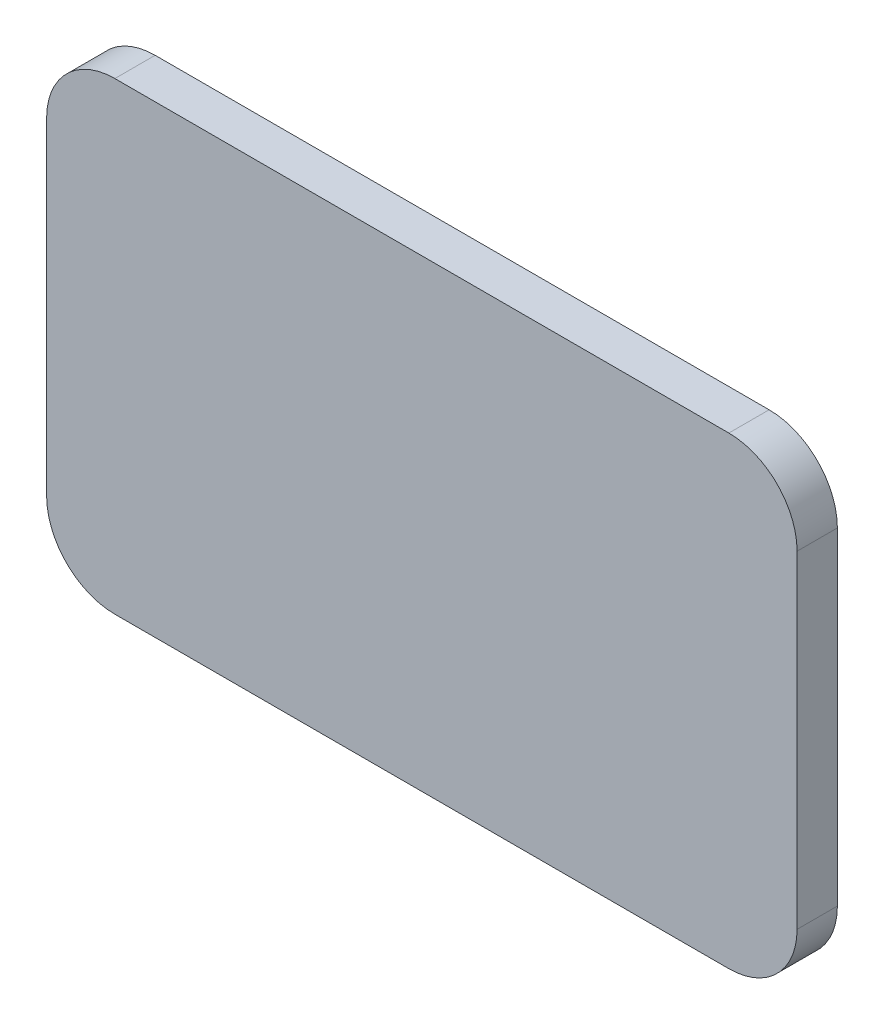
ISO-10303-21;
HEADER;
FILE_DESCRIPTION(('STEP AP214'),'2;1');
FILE_NAME('part.step','',(''),(''),'','','');
FILE_SCHEMA(('AUTOMOTIVE_DESIGN { 1 0 10303 214 1 1 1 1 }'));
ENDSEC;
DATA;
#1=APPLICATION_CONTEXT('core data for automotive mechanical design processes');
#2=APPLICATION_PROTOCOL_DEFINITION('international standard','automotive_design',2000,#1);
#3=PRODUCT_CONTEXT('',#1,'mechanical');
#4=PRODUCT('Part','Part','',(#3));
#5=PRODUCT_RELATED_PRODUCT_CATEGORY('part','',(#4));
#6=PRODUCT_DEFINITION_FORMATION('','',#4);
#7=PRODUCT_DEFINITION_CONTEXT('part definition',#1,'design');
#8=PRODUCT_DEFINITION('design','',#6,#7);
#9=PRODUCT_DEFINITION_SHAPE('','',#8);
#10=(LENGTH_UNIT() NAMED_UNIT(*) SI_UNIT(.MILLI.,.METRE.));
#11=(NAMED_UNIT(*) PLANE_ANGLE_UNIT() SI_UNIT($,.RADIAN.));
#12=(NAMED_UNIT(*) SI_UNIT($,.STERADIAN.) SOLID_ANGLE_UNIT());
#13=UNCERTAINTY_MEASURE_WITH_UNIT(LENGTH_MEASURE(1.E-05),#10,'distance_accuracy_value','');
#14=(GEOMETRIC_REPRESENTATION_CONTEXT(3) GLOBAL_UNCERTAINTY_ASSIGNED_CONTEXT((#13)) GLOBAL_UNIT_ASSIGNED_CONTEXT((#10,
#11,#12)) REPRESENTATION_CONTEXT('',''));
#15=CARTESIAN_POINT('',(0.,0.,0.));
#16=DIRECTION('',(0.,0.,1.));
#17=DIRECTION('',(1.,0.,0.));
#18=AXIS2_PLACEMENT_3D('',#15,#16,#17);
#19=CARTESIAN_POINT('',(2.54,14.732,-1.5));
#20=DIRECTION('',(0.,0.,1.));
#21=DIRECTION('',(1.,0.,0.));
#22=AXIS2_PLACEMENT_3D('',#19,#20,#21);
#23=CYLINDRICAL_SURFACE('',#22,2.54);
#24=CARTESIAN_POINT('',(2.54,14.732,0.));
#25=DIRECTION('',(0.,0.,1.));
#26=DIRECTION('',(-1.,0.,0.));
#27=AXIS2_PLACEMENT_3D('',#24,#25,#26);
#28=CIRCLE('',#27,2.54);
#29=CARTESIAN_POINT('',(2.54000000000002,17.272,0.));
#30=VERTEX_POINT('',#29);
#31=CARTESIAN_POINT('',(0.,14.732,0.));
#32=VERTEX_POINT('',#31);
#33=EDGE_CURVE('E130',#30,#32,#28,.T.);
#34=ORIENTED_EDGE('',*,*,#33,.F.);
#35=DIRECTION('',(0.,0.,1.));
#36=VECTOR('',#35,1.);
#37=CARTESIAN_POINT('',(2.54000000000002,17.272,-1.5));
#38=LINE('',#37,#36);
#39=CARTESIAN_POINT('',(2.54000000000002,17.272,-1.5));
#40=VERTEX_POINT('',#39);
#41=EDGE_CURVE('E11',#40,#30,#38,.T.);
#42=ORIENTED_EDGE('',*,*,#41,.F.);
#43=CARTESIAN_POINT('',(2.54,14.732,-1.5));
#44=DIRECTION('',(0.,0.,1.));
#45=DIRECTION('',(-1.,0.,0.));
#46=AXIS2_PLACEMENT_3D('',#43,#44,#45);
#47=CIRCLE('',#46,2.54);
#48=CARTESIAN_POINT('',(0.,14.732,-1.5));
#49=VERTEX_POINT('',#48);
#50=EDGE_CURVE('E150',#40,#49,#47,.T.);
#51=ORIENTED_EDGE('',*,*,#50,.T.);
#52=DIRECTION('',(0.,0.,1.));
#53=VECTOR('',#52,1.);
#54=CARTESIAN_POINT('',(0.,14.732,-1.5));
#55=LINE('',#54,#53);
#56=EDGE_CURVE('E36',#49,#32,#55,.T.);
#57=ORIENTED_EDGE('',*,*,#56,.T.);
#58=EDGE_LOOP('',(#34,#42,#51,#57));
#59=FACE_BOUND('',#58,.T.);
#60=ADVANCED_FACE('F33',(#59),#23,.T.);
#61=CARTESIAN_POINT('',(2.54000000000002,17.272,-1.5));
#62=DIRECTION('',(0.,1.,0.));
#63=DIRECTION('',(0.,0.,1.));
#64=AXIS2_PLACEMENT_3D('',#61,#62,#63);
#65=PLANE('',#64);
#66=DIRECTION('',(-1.,0.,0.));
#67=VECTOR('',#66,1.);
#68=CARTESIAN_POINT('',(2.54000000000002,17.272,0.));
#69=LINE('',#68,#67);
#70=CARTESIAN_POINT('',(25.4,17.272,0.));
#71=VERTEX_POINT('',#70);
#72=EDGE_CURVE('E148',#71,#30,#69,.T.);
#73=ORIENTED_EDGE('',*,*,#72,.F.);
#74=DIRECTION('',(0.,0.,1.));
#75=VECTOR('',#74,1.);
#76=CARTESIAN_POINT('',(25.4,17.272,-1.5));
#77=LINE('',#76,#75);
#78=CARTESIAN_POINT('',(25.4,17.272,-1.5));
#79=VERTEX_POINT('',#78);
#80=EDGE_CURVE('E42',#79,#71,#77,.T.);
#81=ORIENTED_EDGE('',*,*,#80,.F.);
#82=DIRECTION('',(-1.,0.,0.));
#83=VECTOR('',#82,1.);
#84=CARTESIAN_POINT('',(2.54000000000002,17.272,-1.5));
#85=LINE('',#84,#83);
#86=EDGE_CURVE('E120',#79,#40,#85,.T.);
#87=ORIENTED_EDGE('',*,*,#86,.T.);
#88=ORIENTED_EDGE('',*,*,#41,.T.);
#89=EDGE_LOOP('',(#73,#81,#87,#88));
#90=FACE_BOUND('',#89,.T.);
#91=ADVANCED_FACE('F162',(#90),#65,.T.);
#92=CARTESIAN_POINT('',(25.4,14.732,-1.5));
#93=DIRECTION('',(0.,0.,1.));
#94=DIRECTION('',(1.,0.,0.));
#95=AXIS2_PLACEMENT_3D('',#92,#93,#94);
#96=CYLINDRICAL_SURFACE('',#95,2.54);
#97=CARTESIAN_POINT('',(25.4,14.732,0.));
#98=DIRECTION('',(0.,0.,1.));
#99=DIRECTION('',(-1.,0.,0.));
#100=AXIS2_PLACEMENT_3D('',#97,#98,#99);
#101=CIRCLE('',#100,2.54);
#102=CARTESIAN_POINT('',(27.94,14.732,0.));
#103=VERTEX_POINT('',#102);
#104=EDGE_CURVE('E107',#103,#71,#101,.T.);
#105=ORIENTED_EDGE('',*,*,#104,.F.);
#106=DIRECTION('',(0.,0.,1.));
#107=VECTOR('',#106,1.);
#108=CARTESIAN_POINT('',(27.94,14.732,-1.5));
#109=LINE('',#108,#107);
#110=CARTESIAN_POINT('',(27.94,14.732,-1.5));
#111=VERTEX_POINT('',#110);
#112=EDGE_CURVE('E102',#111,#103,#109,.T.);
#113=ORIENTED_EDGE('',*,*,#112,.F.);
#114=CARTESIAN_POINT('',(25.4,14.732,-1.5));
#115=DIRECTION('',(0.,0.,1.));
#116=DIRECTION('',(-1.,0.,0.));
#117=AXIS2_PLACEMENT_3D('',#114,#115,#116);
#118=CIRCLE('',#117,2.54);
#119=EDGE_CURVE('E105',#111,#79,#118,.T.);
#120=ORIENTED_EDGE('',*,*,#119,.T.);
#121=ORIENTED_EDGE('',*,*,#80,.T.);
#122=EDGE_LOOP('',(#105,#113,#120,#121));
#123=FACE_BOUND('',#122,.T.);
#124=ADVANCED_FACE('F104',(#123),#96,.T.);
#125=CARTESIAN_POINT('',(27.94,2.54000000000002,-1.5));
#126=DIRECTION('',(1.,0.,0.));
#127=DIRECTION('',(0.,0.,-1.));
#128=AXIS2_PLACEMENT_3D('',#125,#126,#127);
#129=PLANE('',#128);
#130=DIRECTION('',(0.,1.,0.));
#131=VECTOR('',#130,1.);
#132=CARTESIAN_POINT('',(27.94,2.54000000000002,0.));
#133=LINE('',#132,#131);
#134=CARTESIAN_POINT('',(27.94,2.54,0.));
#135=VERTEX_POINT('',#134);
#136=EDGE_CURVE('E145',#135,#103,#133,.T.);
#137=ORIENTED_EDGE('',*,*,#136,.F.);
#138=DIRECTION('',(0.,0.,1.));
#139=VECTOR('',#138,1.);
#140=CARTESIAN_POINT('',(27.94,2.54,-1.5));
#141=LINE('',#140,#139);
#142=CARTESIAN_POINT('',(27.94,2.54,-1.5));
#143=VERTEX_POINT('',#142);
#144=EDGE_CURVE('E112',#143,#135,#141,.T.);
#145=ORIENTED_EDGE('',*,*,#144,.F.);
#146=DIRECTION('',(0.,1.,0.));
#147=VECTOR('',#146,1.);
#148=CARTESIAN_POINT('',(27.94,2.54000000000002,-1.5));
#149=LINE('',#148,#147);
#150=EDGE_CURVE('E118',#143,#111,#149,.T.);
#151=ORIENTED_EDGE('',*,*,#150,.T.);
#152=ORIENTED_EDGE('',*,*,#112,.T.);
#153=EDGE_LOOP('',(#137,#145,#151,#152));
#154=FACE_BOUND('',#153,.T.);
#155=ADVANCED_FACE('F122',(#154),#129,.T.);
#156=CARTESIAN_POINT('',(25.4,2.54,-1.5));
#157=DIRECTION('',(0.,0.,1.));
#158=DIRECTION('',(1.,0.,0.));
#159=AXIS2_PLACEMENT_3D('',#156,#157,#158);
#160=CYLINDRICAL_SURFACE('',#159,2.54);
#161=CARTESIAN_POINT('',(25.4,2.54,0.));
#162=DIRECTION('',(0.,0.,1.));
#163=DIRECTION('',(1.,0.,0.));
#164=AXIS2_PLACEMENT_3D('',#161,#162,#163);
#165=CIRCLE('',#164,2.54);
#166=CARTESIAN_POINT('',(25.4,0.,0.));
#167=VERTEX_POINT('',#166);
#168=EDGE_CURVE('E142',#167,#135,#165,.T.);
#169=ORIENTED_EDGE('',*,*,#168,.F.);
#170=DIRECTION('',(0.,0.,1.));
#171=VECTOR('',#170,1.);
#172=CARTESIAN_POINT('',(25.4,0.,-1.5));
#173=LINE('',#172,#171);
#174=CARTESIAN_POINT('',(25.4,0.,-1.5));
#175=VERTEX_POINT('',#174);
#176=EDGE_CURVE('E154',#175,#167,#173,.T.);
#177=ORIENTED_EDGE('',*,*,#176,.F.);
#178=CARTESIAN_POINT('',(25.4,2.54,-1.5));
#179=DIRECTION('',(0.,0.,1.));
#180=DIRECTION('',(1.,0.,0.));
#181=AXIS2_PLACEMENT_3D('',#178,#179,#180);
#182=CIRCLE('',#181,2.54);
#183=EDGE_CURVE('E123',#175,#143,#182,.T.);
#184=ORIENTED_EDGE('',*,*,#183,.T.);
#185=ORIENTED_EDGE('',*,*,#144,.T.);
#186=EDGE_LOOP('',(#169,#177,#184,#185));
#187=FACE_BOUND('',#186,.T.);
#188=ADVANCED_FACE('F175',(#187),#160,.T.);
#189=CARTESIAN_POINT('',(2.54000000000002,0.,-1.5));
#190=DIRECTION('',(0.,-1.,0.));
#191=DIRECTION('',(0.,0.,-1.));
#192=AXIS2_PLACEMENT_3D('',#189,#190,#191);
#193=PLANE('',#192);
#194=DIRECTION('',(1.,0.,0.));
#195=VECTOR('',#194,1.);
#196=CARTESIAN_POINT('',(2.54000000000002,0.,0.));
#197=LINE('',#196,#195);
#198=CARTESIAN_POINT('',(2.54000000000002,0.,0.));
#199=VERTEX_POINT('',#198);
#200=EDGE_CURVE('E139',#199,#167,#197,.T.);
#201=ORIENTED_EDGE('',*,*,#200,.F.);
#202=DIRECTION('',(0.,0.,1.));
#203=VECTOR('',#202,1.);
#204=CARTESIAN_POINT('',(2.54000000000002,0.,-1.5));
#205=LINE('',#204,#203);
#206=CARTESIAN_POINT('',(2.54000000000002,0.,-1.5));
#207=VERTEX_POINT('',#206);
#208=EDGE_CURVE('E156',#207,#199,#205,.T.);
#209=ORIENTED_EDGE('',*,*,#208,.F.);
#210=DIRECTION('',(1.,0.,0.));
#211=VECTOR('',#210,1.);
#212=CARTESIAN_POINT('',(2.54000000000002,0.,-1.5));
#213=LINE('',#212,#211);
#214=EDGE_CURVE('E125',#207,#175,#213,.T.);
#215=ORIENTED_EDGE('',*,*,#214,.T.);
#216=ORIENTED_EDGE('',*,*,#176,.T.);
#217=EDGE_LOOP('',(#201,#209,#215,#216));
#218=FACE_BOUND('',#217,.T.);
#219=ADVANCED_FACE('F178',(#218),#193,.T.);
#220=CARTESIAN_POINT('',(2.54,2.54,-1.5));
#221=DIRECTION('',(0.,0.,1.));
#222=DIRECTION('',(1.,0.,0.));
#223=AXIS2_PLACEMENT_3D('',#220,#221,#222);
#224=CYLINDRICAL_SURFACE('',#223,2.54);
#225=CARTESIAN_POINT('',(2.54,2.54,0.));
#226=DIRECTION('',(0.,0.,1.));
#227=DIRECTION('',(-1.,0.,0.));
#228=AXIS2_PLACEMENT_3D('',#225,#226,#227);
#229=CIRCLE('',#228,2.54);
#230=CARTESIAN_POINT('',(0.,2.54000000000002,0.));
#231=VERTEX_POINT('',#230);
#232=EDGE_CURVE('E136',#231,#199,#229,.T.);
#233=ORIENTED_EDGE('',*,*,#232,.F.);
#234=DIRECTION('',(0.,0.,1.));
#235=VECTOR('',#234,1.);
#236=CARTESIAN_POINT('',(0.,2.54000000000002,-1.5));
#237=LINE('',#236,#235);
#238=CARTESIAN_POINT('',(0.,2.54000000000002,-1.5));
#239=VERTEX_POINT('',#238);
#240=EDGE_CURVE('E157',#239,#231,#237,.T.);
#241=ORIENTED_EDGE('',*,*,#240,.F.);
#242=CARTESIAN_POINT('',(2.54,2.54,-1.5));
#243=DIRECTION('',(0.,0.,1.));
#244=DIRECTION('',(-1.,0.,0.));
#245=AXIS2_PLACEMENT_3D('',#242,#243,#244);
#246=CIRCLE('',#245,2.54);
#247=EDGE_CURVE('E253',#239,#207,#246,.T.);
#248=ORIENTED_EDGE('',*,*,#247,.T.);
#249=ORIENTED_EDGE('',*,*,#208,.T.);
#250=EDGE_LOOP('',(#233,#241,#248,#249));
#251=FACE_BOUND('',#250,.T.);
#252=ADVANCED_FACE('F182',(#251),#224,.T.);
#253=CARTESIAN_POINT('',(0.,2.54000000000002,-1.5));
#254=DIRECTION('',(-1.,0.,0.));
#255=DIRECTION('',(0.,0.,1.));
#256=AXIS2_PLACEMENT_3D('',#253,#254,#255);
#257=PLANE('',#256);
#258=DIRECTION('',(0.,-1.,0.));
#259=VECTOR('',#258,1.);
#260=CARTESIAN_POINT('',(0.,2.54000000000002,0.));
#261=LINE('',#260,#259);
#262=EDGE_CURVE('E133',#32,#231,#261,.T.);
#263=ORIENTED_EDGE('',*,*,#262,.F.);
#264=ORIENTED_EDGE('',*,*,#56,.F.);
#265=DIRECTION('',(0.,-1.,0.));
#266=VECTOR('',#265,1.);
#267=CARTESIAN_POINT('',(0.,2.54000000000002,-1.5));
#268=LINE('',#267,#266);
#269=EDGE_CURVE('E254',#49,#239,#268,.T.);
#270=ORIENTED_EDGE('',*,*,#269,.T.);
#271=ORIENTED_EDGE('',*,*,#240,.T.);
#272=EDGE_LOOP('',(#263,#264,#270,#271));
#273=FACE_BOUND('',#272,.T.);
#274=ADVANCED_FACE('F159',(#273),#257,.T.);
#275=CARTESIAN_POINT('',(2.54,14.732,-1.5));
#276=DIRECTION('',(0.,0.,-1.));
#277=DIRECTION('',(-1.,0.,0.));
#278=AXIS2_PLACEMENT_3D('',#275,#276,#277);
#279=PLANE('',#278);
#280=ORIENTED_EDGE('',*,*,#50,.F.);
#281=ORIENTED_EDGE('',*,*,#86,.F.);
#282=ORIENTED_EDGE('',*,*,#119,.F.);
#283=ORIENTED_EDGE('',*,*,#150,.F.);
#284=ORIENTED_EDGE('',*,*,#183,.F.);
#285=ORIENTED_EDGE('',*,*,#214,.F.);
#286=ORIENTED_EDGE('',*,*,#247,.F.);
#287=ORIENTED_EDGE('',*,*,#269,.F.);
#288=EDGE_LOOP('',(#280,#281,#282,#283,#284,#285,#286,#287));
#289=FACE_BOUND('',#288,.T.);
#290=ADVANCED_FACE('F116',(#289),#279,.T.);
#291=CARTESIAN_POINT('',(2.54,14.732,0.));
#292=DIRECTION('',(0.,0.,-1.));
#293=DIRECTION('',(-1.,0.,0.));
#294=AXIS2_PLACEMENT_3D('',#291,#292,#293);
#295=PLANE('',#294);
#296=ORIENTED_EDGE('',*,*,#33,.T.);
#297=ORIENTED_EDGE('',*,*,#262,.T.);
#298=ORIENTED_EDGE('',*,*,#232,.T.);
#299=ORIENTED_EDGE('',*,*,#200,.T.);
#300=ORIENTED_EDGE('',*,*,#168,.T.);
#301=ORIENTED_EDGE('',*,*,#136,.T.);
#302=ORIENTED_EDGE('',*,*,#104,.T.);
#303=ORIENTED_EDGE('',*,*,#72,.T.);
#304=EDGE_LOOP('',(#296,#297,#298,#299,#300,#301,#302,#303));
#305=FACE_BOUND('',#304,.T.);
#306=ADVANCED_FACE('F161',(#305),#295,.F.);
#307=CLOSED_SHELL('',(#60,#91,#124,#155,#188,#219,#252,#274,#290,#306));
#308=MANIFOLD_SOLID_BREP('B2',#307);
#309=ADVANCED_BREP_SHAPE_REPRESENTATION('',(#18,#308),#14);
#310=SHAPE_DEFINITION_REPRESENTATION(#9,#309);
ENDSEC;
END-ISO-10303-21;
